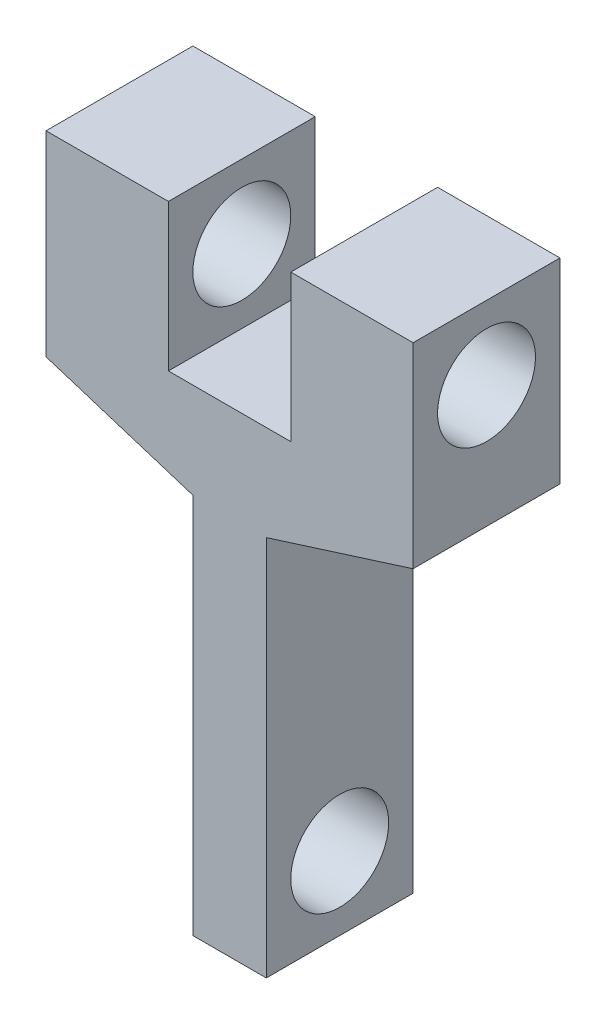
ISO-10303-21;
HEADER;
FILE_DESCRIPTION(('STEP AP214'),'2;1');
FILE_NAME('part.step','',(''),(''),'','','');
FILE_SCHEMA(('AUTOMOTIVE_DESIGN { 1 0 10303 214 1 1 1 1 }'));
ENDSEC;
DATA;
#1=APPLICATION_CONTEXT('core data for automotive mechanical design processes');
#2=APPLICATION_PROTOCOL_DEFINITION('international standard','automotive_design',2000,#1);
#3=PRODUCT_CONTEXT('',#1,'mechanical');
#4=PRODUCT('Part','Part','',(#3));
#5=PRODUCT_RELATED_PRODUCT_CATEGORY('part','',(#4));
#6=PRODUCT_DEFINITION_FORMATION('','',#4);
#7=PRODUCT_DEFINITION_CONTEXT('part definition',#1,'design');
#8=PRODUCT_DEFINITION('design','',#6,#7);
#9=PRODUCT_DEFINITION_SHAPE('','',#8);
#10=(LENGTH_UNIT() NAMED_UNIT(*) SI_UNIT(.MILLI.,.METRE.));
#11=(NAMED_UNIT(*) PLANE_ANGLE_UNIT() SI_UNIT($,.RADIAN.));
#12=(NAMED_UNIT(*) SI_UNIT($,.STERADIAN.) SOLID_ANGLE_UNIT());
#13=UNCERTAINTY_MEASURE_WITH_UNIT(LENGTH_MEASURE(1.E-05),#10,'distance_accuracy_value','');
#14=(GEOMETRIC_REPRESENTATION_CONTEXT(3) GLOBAL_UNCERTAINTY_ASSIGNED_CONTEXT((#13)) GLOBAL_UNIT_ASSIGNED_CONTEXT((#10,
#11,#12)) REPRESENTATION_CONTEXT('',''));
#15=CARTESIAN_POINT('',(0.,0.,0.));
#16=DIRECTION('',(0.,0.,1.));
#17=DIRECTION('',(1.,0.,0.));
#18=AXIS2_PLACEMENT_3D('',#15,#16,#17);
#19=CARTESIAN_POINT('',(2.5,9.7411897148694,6.));
#20=DIRECTION('',(1.,0.,0.));
#21=DIRECTION('',(0.,0.,-1.));
#22=AXIS2_PLACEMENT_3D('',#19,#20,#21);
#23=PLANE('',#22);
#24=CARTESIAN_POINT('',(2.5,12.7411897148694,3.));
#25=DIRECTION('',(1.,0.,0.));
#26=DIRECTION('',(0.,0.,-1.));
#27=AXIS2_PLACEMENT_3D('',#24,#25,#26);
#28=CIRCLE('',#27,2.);
#29=CARTESIAN_POINT('',(2.5,12.7411897148694,1.));
#30=VERTEX_POINT('',#29);
#31=EDGE_CURVE('E158',#30,#30,#28,.T.);
#32=ORIENTED_EDGE('',*,*,#31,.T.);
#33=EDGE_LOOP('',(#32));
#34=FACE_BOUND('',#33,.T.);
#35=DIRECTION('',(0.,-1.,0.));
#36=VECTOR('',#35,1.);
#37=CARTESIAN_POINT('',(2.5,9.7411897148694,0.));
#38=LINE('',#37,#36);
#39=CARTESIAN_POINT('',(2.5,15.7411897148694,0.));
#40=VERTEX_POINT('',#39);
#41=CARTESIAN_POINT('',(2.5,9.7411897148694,0.));
#42=VERTEX_POINT('',#41);
#43=EDGE_CURVE('E154',#40,#42,#38,.T.);
#44=ORIENTED_EDGE('',*,*,#43,.T.);
#45=DIRECTION('',(0.,0.,-1.));
#46=VECTOR('',#45,1.);
#47=CARTESIAN_POINT('',(2.5,9.7411897148694,6.));
#48=LINE('',#47,#46);
#49=CARTESIAN_POINT('',(2.5,9.7411897148694,6.));
#50=VERTEX_POINT('',#49);
#51=EDGE_CURVE('E11',#50,#42,#48,.T.);
#52=ORIENTED_EDGE('',*,*,#51,.F.);
#53=DIRECTION('',(0.,-1.,0.));
#54=VECTOR('',#53,1.);
#55=CARTESIAN_POINT('',(2.5,9.7411897148694,6.));
#56=LINE('',#55,#54);
#57=CARTESIAN_POINT('',(2.5,15.7411897148694,6.));
#58=VERTEX_POINT('',#57);
#59=EDGE_CURVE('E177',#58,#50,#56,.T.);
#60=ORIENTED_EDGE('',*,*,#59,.F.);
#61=DIRECTION('',(0.,0.,-1.));
#62=VECTOR('',#61,1.);
#63=CARTESIAN_POINT('',(2.5,15.7411897148694,6.));
#64=LINE('',#63,#62);
#65=EDGE_CURVE('E150',#58,#40,#64,.T.);
#66=ORIENTED_EDGE('',*,*,#65,.T.);
#67=EDGE_LOOP('',(#44,#52,#60,#66));
#68=FACE_BOUND('',#67,.T.);
#69=ADVANCED_FACE('F34',(#34,#68),#23,.F.);
#70=CARTESIAN_POINT('',(-2.5,9.7411897148694,6.));
#71=DIRECTION('',(0.,-1.,0.));
#72=DIRECTION('',(0.,0.,-1.));
#73=AXIS2_PLACEMENT_3D('',#70,#71,#72);
#74=PLANE('',#73);
#75=DIRECTION('',(-1.,0.,0.));
#76=VECTOR('',#75,1.);
#77=CARTESIAN_POINT('',(-2.5,9.7411897148694,0.));
#78=LINE('',#77,#76);
#79=CARTESIAN_POINT('',(-2.5,9.7411897148694,0.));
#80=VERTEX_POINT('',#79);
#81=EDGE_CURVE('E157',#42,#80,#78,.T.);
#82=ORIENTED_EDGE('',*,*,#81,.T.);
#83=DIRECTION('',(0.,0.,-1.));
#84=VECTOR('',#83,1.);
#85=CARTESIAN_POINT('',(-2.5,9.7411897148694,6.));
#86=LINE('',#85,#84);
#87=CARTESIAN_POINT('',(-2.5,9.7411897148694,6.));
#88=VERTEX_POINT('',#87);
#89=EDGE_CURVE('E42',#88,#80,#86,.T.);
#90=ORIENTED_EDGE('',*,*,#89,.F.);
#91=DIRECTION('',(-1.,0.,0.));
#92=VECTOR('',#91,1.);
#93=CARTESIAN_POINT('',(-2.5,9.7411897148694,6.));
#94=LINE('',#93,#92);
#95=EDGE_CURVE('E105',#50,#88,#94,.T.);
#96=ORIENTED_EDGE('',*,*,#95,.F.);
#97=ORIENTED_EDGE('',*,*,#51,.T.);
#98=EDGE_LOOP('',(#82,#90,#96,#97));
#99=FACE_BOUND('',#98,.T.);
#100=ADVANCED_FACE('F256',(#99),#74,.F.);
#101=CARTESIAN_POINT('',(-2.5,9.7411897148694,6.));
#102=DIRECTION('',(-1.,0.,0.));
#103=DIRECTION('',(0.,0.,1.));
#104=AXIS2_PLACEMENT_3D('',#101,#102,#103);
#105=PLANE('',#104);
#106=CARTESIAN_POINT('',(-2.5,12.7411897148694,3.));
#107=DIRECTION('',(-1.,0.,0.));
#108=DIRECTION('',(0.,0.,1.));
#109=AXIS2_PLACEMENT_3D('',#106,#107,#108);
#110=CIRCLE('',#109,2.);
#111=CARTESIAN_POINT('',(-2.5,12.7411897148694,5.));
#112=VERTEX_POINT('',#111);
#113=EDGE_CURVE('E264',#112,#112,#110,.T.);
#114=ORIENTED_EDGE('',*,*,#113,.T.);
#115=EDGE_LOOP('',(#114));
#116=FACE_BOUND('',#115,.T.);
#117=DIRECTION('',(0.,1.,0.));
#118=VECTOR('',#117,1.);
#119=CARTESIAN_POINT('',(-2.5,9.7411897148694,0.));
#120=LINE('',#119,#118);
#121=CARTESIAN_POINT('',(-2.5,15.7411897148694,0.));
#122=VERTEX_POINT('',#121);
#123=EDGE_CURVE('E160',#80,#122,#120,.T.);
#124=ORIENTED_EDGE('',*,*,#123,.T.);
#125=DIRECTION('',(0.,0.,-1.));
#126=VECTOR('',#125,1.);
#127=CARTESIAN_POINT('',(-2.5,15.7411897148694,6.));
#128=LINE('',#127,#126);
#129=CARTESIAN_POINT('',(-2.5,15.7411897148694,6.));
#130=VERTEX_POINT('',#129);
#131=EDGE_CURVE('E196',#130,#122,#128,.T.);
#132=ORIENTED_EDGE('',*,*,#131,.F.);
#133=DIRECTION('',(0.,1.,0.));
#134=VECTOR('',#133,1.);
#135=CARTESIAN_POINT('',(-2.5,9.7411897148694,6.));
#136=LINE('',#135,#134);
#137=EDGE_CURVE('E204',#88,#130,#136,.T.);
#138=ORIENTED_EDGE('',*,*,#137,.F.);
#139=ORIENTED_EDGE('',*,*,#89,.T.);
#140=EDGE_LOOP('',(#124,#132,#138,#139));
#141=FACE_BOUND('',#140,.T.);
#142=ADVANCED_FACE('F202',(#116,#141),#105,.F.);
#143=CARTESIAN_POINT('',(-2.5,15.7411897148694,6.));
#144=DIRECTION('',(0.,-1.,0.));
#145=DIRECTION('',(1.,0.,0.));
#146=AXIS2_PLACEMENT_3D('',#143,#144,#145);
#147=PLANE('',#146);
#148=DIRECTION('',(-1.,0.,0.));
#149=VECTOR('',#148,1.);
#150=CARTESIAN_POINT('',(-2.5,15.7411897148694,0.));
#151=LINE('',#150,#149);
#152=CARTESIAN_POINT('',(-7.5,15.7411897148694,0.));
#153=VERTEX_POINT('',#152);
#154=EDGE_CURVE('E162',#122,#153,#151,.T.);
#155=ORIENTED_EDGE('',*,*,#154,.T.);
#156=DIRECTION('',(0.,0.,-1.));
#157=VECTOR('',#156,1.);
#158=CARTESIAN_POINT('',(-7.5,15.7411897148694,6.));
#159=LINE('',#158,#157);
#160=CARTESIAN_POINT('',(-7.5,15.7411897148694,6.));
#161=VERTEX_POINT('',#160);
#162=EDGE_CURVE('E193',#161,#153,#159,.T.);
#163=ORIENTED_EDGE('',*,*,#162,.F.);
#164=DIRECTION('',(-1.,0.,0.));
#165=VECTOR('',#164,1.);
#166=CARTESIAN_POINT('',(-2.5,15.7411897148694,6.));
#167=LINE('',#166,#165);
#168=EDGE_CURVE('E222',#130,#161,#167,.T.);
#169=ORIENTED_EDGE('',*,*,#168,.F.);
#170=ORIENTED_EDGE('',*,*,#131,.T.);
#171=EDGE_LOOP('',(#155,#163,#169,#170));
#172=FACE_BOUND('',#171,.T.);
#173=ADVANCED_FACE('F213',(#172),#147,.F.);
#174=CARTESIAN_POINT('',(-7.5,7.74118971486941,6.));
#175=DIRECTION('',(1.,0.,0.));
#176=DIRECTION('',(0.,0.,-1.));
#177=AXIS2_PLACEMENT_3D('',#174,#175,#176);
#178=PLANE('',#177);
#179=CARTESIAN_POINT('',(-7.5,12.7411897148694,3.));
#180=DIRECTION('',(1.,0.,0.));
#181=DIRECTION('',(0.,0.,-1.));
#182=AXIS2_PLACEMENT_3D('',#179,#180,#181);
#183=CIRCLE('',#182,2.);
#184=CARTESIAN_POINT('',(-7.5,12.7411897148694,1.));
#185=VERTEX_POINT('',#184);
#186=EDGE_CURVE('E267',#185,#185,#183,.F.);
#187=ORIENTED_EDGE('',*,*,#186,.F.);
#188=EDGE_LOOP('',(#187));
#189=FACE_BOUND('',#188,.T.);
#190=DIRECTION('',(0.,-1.,0.));
#191=VECTOR('',#190,1.);
#192=CARTESIAN_POINT('',(-7.5,7.74118971486941,0.));
#193=LINE('',#192,#191);
#194=CARTESIAN_POINT('',(-7.5,7.74118971486941,0.));
#195=VERTEX_POINT('',#194);
#196=EDGE_CURVE('E164',#153,#195,#193,.T.);
#197=ORIENTED_EDGE('',*,*,#196,.T.);
#198=DIRECTION('',(0.,0.,-1.));
#199=VECTOR('',#198,1.);
#200=CARTESIAN_POINT('',(-7.5,7.74118971486941,6.));
#201=LINE('',#200,#199);
#202=CARTESIAN_POINT('',(-7.5,7.74118971486941,6.));
#203=VERTEX_POINT('',#202);
#204=EDGE_CURVE('E190',#203,#195,#201,.T.);
#205=ORIENTED_EDGE('',*,*,#204,.F.);
#206=DIRECTION('',(0.,-1.,0.));
#207=VECTOR('',#206,1.);
#208=CARTESIAN_POINT('',(-7.5,7.74118971486941,6.));
#209=LINE('',#208,#207);
#210=EDGE_CURVE('E219',#161,#203,#209,.T.);
#211=ORIENTED_EDGE('',*,*,#210,.F.);
#212=ORIENTED_EDGE('',*,*,#162,.T.);
#213=EDGE_LOOP('',(#197,#205,#211,#212));
#214=FACE_BOUND('',#213,.T.);
#215=ADVANCED_FACE('F217',(#189,#214),#178,.F.);
#216=CARTESIAN_POINT('',(-7.5,7.74118971486941,6.));
#217=DIRECTION('',(0.301382660764141,0.953503273088628,0.));
#218=DIRECTION('',(-0.953503273088628,0.301382660764141,0.));
#219=AXIS2_PLACEMENT_3D('',#216,#217,#218);
#220=PLANE('',#219);
#221=DIRECTION('',(0.953503273088628,-0.301382660764141,0.));
#222=VECTOR('',#221,1.);
#223=CARTESIAN_POINT('',(-7.5,7.74118971486941,0.));
#224=LINE('',#223,#222);
#225=CARTESIAN_POINT('',(-1.5,5.84471382892164,0.));
#226=VERTEX_POINT('',#225);
#227=EDGE_CURVE('E166',#195,#226,#224,.T.);
#228=ORIENTED_EDGE('',*,*,#227,.T.);
#229=DIRECTION('',(0.,0.,-1.));
#230=VECTOR('',#229,1.);
#231=CARTESIAN_POINT('',(-1.5,5.84471382892164,6.));
#232=LINE('',#231,#230);
#233=CARTESIAN_POINT('',(-1.5,5.84471382892164,6.));
#234=VERTEX_POINT('',#233);
#235=EDGE_CURVE('E187',#234,#226,#232,.T.);
#236=ORIENTED_EDGE('',*,*,#235,.F.);
#237=DIRECTION('',(0.953503273088628,-0.301382660764141,0.));
#238=VECTOR('',#237,1.);
#239=CARTESIAN_POINT('',(-7.5,7.74118971486941,6.));
#240=LINE('',#239,#238);
#241=EDGE_CURVE('E221',#203,#234,#240,.T.);
#242=ORIENTED_EDGE('',*,*,#241,.F.);
#243=ORIENTED_EDGE('',*,*,#204,.T.);
#244=EDGE_LOOP('',(#228,#236,#242,#243));
#245=FACE_BOUND('',#244,.T.);
#246=ADVANCED_FACE('F298',(#245),#220,.F.);
#247=CARTESIAN_POINT('',(-1.5,5.84471382892164,6.));
#248=DIRECTION('',(1.,0.,0.));
#249=DIRECTION('',(0.,1.,0.));
#250=AXIS2_PLACEMENT_3D('',#247,#248,#249);
#251=PLANE('',#250);
#252=CARTESIAN_POINT('',(-1.5,-6.7411897148694,3.));
#253=DIRECTION('',(1.,0.,0.));
#254=DIRECTION('',(0.,1.,0.));
#255=AXIS2_PLACEMENT_3D('',#252,#253,#254);
#256=CIRCLE('',#255,2.);
#257=CARTESIAN_POINT('',(-1.5,-4.7411897148694,3.));
#258=VERTEX_POINT('',#257);
#259=EDGE_CURVE('E277',#258,#258,#256,.F.);
#260=ORIENTED_EDGE('',*,*,#259,.F.);
#261=EDGE_LOOP('',(#260));
#262=FACE_BOUND('',#261,.T.);
#263=DIRECTION('',(0.,-1.,0.));
#264=VECTOR('',#263,1.);
#265=CARTESIAN_POINT('',(-1.5,5.84471382892164,0.));
#266=LINE('',#265,#264);
#267=CARTESIAN_POINT('',(-1.5,-9.7411897148694,0.));
#268=VERTEX_POINT('',#267);
#269=EDGE_CURVE('E168',#226,#268,#266,.T.);
#270=ORIENTED_EDGE('',*,*,#269,.T.);
#271=DIRECTION('',(0.,0.,-1.));
#272=VECTOR('',#271,1.);
#273=CARTESIAN_POINT('',(-1.5,-9.7411897148694,6.));
#274=LINE('',#273,#272);
#275=CARTESIAN_POINT('',(-1.5,-9.7411897148694,6.));
#276=VERTEX_POINT('',#275);
#277=EDGE_CURVE('E184',#276,#268,#274,.T.);
#278=ORIENTED_EDGE('',*,*,#277,.F.);
#279=DIRECTION('',(0.,-1.,0.));
#280=VECTOR('',#279,1.);
#281=CARTESIAN_POINT('',(-1.5,5.84471382892164,6.));
#282=LINE('',#281,#280);
#283=EDGE_CURVE('E224',#234,#276,#282,.T.);
#284=ORIENTED_EDGE('',*,*,#283,.F.);
#285=ORIENTED_EDGE('',*,*,#235,.T.);
#286=EDGE_LOOP('',(#270,#278,#284,#285));
#287=FACE_BOUND('',#286,.T.);
#288=ADVANCED_FACE('F293',(#262,#287),#251,.F.);
#289=CARTESIAN_POINT('',(-1.5,-9.7411897148694,6.));
#290=DIRECTION('',(0.,1.,0.));
#291=DIRECTION('',(0.,0.,1.));
#292=AXIS2_PLACEMENT_3D('',#289,#290,#291);
#293=PLANE('',#292);
#294=DIRECTION('',(1.,0.,0.));
#295=VECTOR('',#294,1.);
#296=CARTESIAN_POINT('',(-1.5,-9.7411897148694,0.));
#297=LINE('',#296,#295);
#298=CARTESIAN_POINT('',(1.5,-9.7411897148694,0.));
#299=VERTEX_POINT('',#298);
#300=EDGE_CURVE('E170',#268,#299,#297,.T.);
#301=ORIENTED_EDGE('',*,*,#300,.T.);
#302=DIRECTION('',(0.,0.,-1.));
#303=VECTOR('',#302,1.);
#304=CARTESIAN_POINT('',(1.5,-9.7411897148694,6.));
#305=LINE('',#304,#303);
#306=CARTESIAN_POINT('',(1.5,-9.7411897148694,6.));
#307=VERTEX_POINT('',#306);
#308=EDGE_CURVE('E181',#307,#299,#305,.T.);
#309=ORIENTED_EDGE('',*,*,#308,.F.);
#310=DIRECTION('',(1.,0.,0.));
#311=VECTOR('',#310,1.);
#312=CARTESIAN_POINT('',(-1.5,-9.7411897148694,6.));
#313=LINE('',#312,#311);
#314=EDGE_CURVE('E230',#276,#307,#313,.T.);
#315=ORIENTED_EDGE('',*,*,#314,.F.);
#316=ORIENTED_EDGE('',*,*,#277,.T.);
#317=EDGE_LOOP('',(#301,#309,#315,#316));
#318=FACE_BOUND('',#317,.T.);
#319=ADVANCED_FACE('F236',(#318),#293,.F.);
#320=CARTESIAN_POINT('',(1.5,5.84471382892164,6.));
#321=DIRECTION('',(-1.,0.,0.));
#322=DIRECTION('',(0.,-1.,0.));
#323=AXIS2_PLACEMENT_3D('',#320,#321,#322);
#324=PLANE('',#323);
#325=CARTESIAN_POINT('',(1.5,-6.7411897148694,3.));
#326=DIRECTION('',(1.,0.,0.));
#327=DIRECTION('',(0.,1.,0.));
#328=AXIS2_PLACEMENT_3D('',#325,#326,#327);
#329=CIRCLE('',#328,2.);
#330=CARTESIAN_POINT('',(1.5,-4.7411897148694,3.));
#331=VERTEX_POINT('',#330);
#332=EDGE_CURVE('E280',#331,#331,#329,.T.);
#333=ORIENTED_EDGE('',*,*,#332,.F.);
#334=EDGE_LOOP('',(#333));
#335=FACE_BOUND('',#334,.T.);
#336=DIRECTION('',(0.,1.,0.));
#337=VECTOR('',#336,1.);
#338=CARTESIAN_POINT('',(1.5,5.84471382892164,0.));
#339=LINE('',#338,#337);
#340=CARTESIAN_POINT('',(1.5,5.84471382892164,0.));
#341=VERTEX_POINT('',#340);
#342=EDGE_CURVE('E172',#299,#341,#339,.T.);
#343=ORIENTED_EDGE('',*,*,#342,.T.);
#344=DIRECTION('',(0.,0.,-1.));
#345=VECTOR('',#344,1.);
#346=CARTESIAN_POINT('',(1.5,5.84471382892164,6.));
#347=LINE('',#346,#345);
#348=CARTESIAN_POINT('',(1.5,5.84471382892164,6.));
#349=VERTEX_POINT('',#348);
#350=EDGE_CURVE('E145',#349,#341,#347,.T.);
#351=ORIENTED_EDGE('',*,*,#350,.F.);
#352=DIRECTION('',(0.,1.,0.));
#353=VECTOR('',#352,1.);
#354=CARTESIAN_POINT('',(1.5,5.84471382892164,6.));
#355=LINE('',#354,#353);
#356=EDGE_CURVE('E136',#307,#349,#355,.T.);
#357=ORIENTED_EDGE('',*,*,#356,.F.);
#358=ORIENTED_EDGE('',*,*,#308,.T.);
#359=EDGE_LOOP('',(#343,#351,#357,#358));
#360=FACE_BOUND('',#359,.T.);
#361=ADVANCED_FACE('F240',(#335,#360),#324,.F.);
#362=CARTESIAN_POINT('',(7.5,7.74118971486941,6.));
#363=DIRECTION('',(-0.301382660764141,0.953503273088628,0.));
#364=DIRECTION('',(-0.953503273088628,-0.301382660764141,0.));
#365=AXIS2_PLACEMENT_3D('',#362,#363,#364);
#366=PLANE('',#365);
#367=DIRECTION('',(0.953503273088628,0.301382660764141,0.));
#368=VECTOR('',#367,1.);
#369=CARTESIAN_POINT('',(7.5,7.74118971486941,0.));
#370=LINE('',#369,#368);
#371=CARTESIAN_POINT('',(7.5,7.74118971486941,0.));
#372=VERTEX_POINT('',#371);
#373=EDGE_CURVE('E144',#341,#372,#370,.T.);
#374=ORIENTED_EDGE('',*,*,#373,.T.);
#375=DIRECTION('',(0.,0.,-1.));
#376=VECTOR('',#375,1.);
#377=CARTESIAN_POINT('',(7.5,7.74118971486941,6.));
#378=LINE('',#377,#376);
#379=CARTESIAN_POINT('',(7.5,7.74118971486941,6.));
#380=VERTEX_POINT('',#379);
#381=EDGE_CURVE('E141',#380,#372,#378,.T.);
#382=ORIENTED_EDGE('',*,*,#381,.F.);
#383=DIRECTION('',(0.953503273088628,0.301382660764141,0.));
#384=VECTOR('',#383,1.);
#385=CARTESIAN_POINT('',(7.5,7.74118971486941,6.));
#386=LINE('',#385,#384);
#387=EDGE_CURVE('E130',#349,#380,#386,.T.);
#388=ORIENTED_EDGE('',*,*,#387,.F.);
#389=ORIENTED_EDGE('',*,*,#350,.T.);
#390=EDGE_LOOP('',(#374,#382,#388,#389));
#391=FACE_BOUND('',#390,.T.);
#392=ADVANCED_FACE('F142',(#391),#366,.F.);
#393=CARTESIAN_POINT('',(7.5,7.74118971486941,6.));
#394=DIRECTION('',(-1.,0.,0.));
#395=DIRECTION('',(0.,0.,1.));
#396=AXIS2_PLACEMENT_3D('',#393,#394,#395);
#397=PLANE('',#396);
#398=CARTESIAN_POINT('',(7.5,12.7411897148694,3.));
#399=DIRECTION('',(1.,0.,0.));
#400=DIRECTION('',(0.,0.,-1.));
#401=AXIS2_PLACEMENT_3D('',#398,#399,#400);
#402=CIRCLE('',#401,2.);
#403=CARTESIAN_POINT('',(7.5,12.7411897148694,1.));
#404=VERTEX_POINT('',#403);
#405=EDGE_CURVE('E274',#404,#404,#402,.T.);
#406=ORIENTED_EDGE('',*,*,#405,.F.);
#407=EDGE_LOOP('',(#406));
#408=FACE_BOUND('',#407,.T.);
#409=DIRECTION('',(0.,1.,0.));
#410=VECTOR('',#409,1.);
#411=CARTESIAN_POINT('',(7.5,7.74118971486941,0.));
#412=LINE('',#411,#410);
#413=CARTESIAN_POINT('',(7.5,15.7411897148694,0.));
#414=VERTEX_POINT('',#413);
#415=EDGE_CURVE('E91',#372,#414,#412,.T.);
#416=ORIENTED_EDGE('',*,*,#415,.T.);
#417=DIRECTION('',(0.,0.,-1.));
#418=VECTOR('',#417,1.);
#419=CARTESIAN_POINT('',(7.5,15.7411897148694,6.));
#420=LINE('',#419,#418);
#421=CARTESIAN_POINT('',(7.5,15.7411897148694,6.));
#422=VERTEX_POINT('',#421);
#423=EDGE_CURVE('E146',#422,#414,#420,.T.);
#424=ORIENTED_EDGE('',*,*,#423,.F.);
#425=DIRECTION('',(0.,1.,0.));
#426=VECTOR('',#425,1.);
#427=CARTESIAN_POINT('',(7.5,7.74118971486941,6.));
#428=LINE('',#427,#426);
#429=EDGE_CURVE('E134',#380,#422,#428,.T.);
#430=ORIENTED_EDGE('',*,*,#429,.F.);
#431=ORIENTED_EDGE('',*,*,#381,.T.);
#432=EDGE_LOOP('',(#416,#424,#430,#431));
#433=FACE_BOUND('',#432,.T.);
#434=ADVANCED_FACE('F148',(#408,#433),#397,.F.);
#435=CARTESIAN_POINT('',(2.5,15.7411897148694,6.));
#436=DIRECTION('',(0.,-1.,0.));
#437=DIRECTION('',(1.,0.,0.));
#438=AXIS2_PLACEMENT_3D('',#435,#436,#437);
#439=PLANE('',#438);
#440=DIRECTION('',(-1.,0.,0.));
#441=VECTOR('',#440,1.);
#442=CARTESIAN_POINT('',(2.5,15.7411897148694,0.));
#443=LINE('',#442,#441);
#444=EDGE_CURVE('E97',#414,#40,#443,.T.);
#445=ORIENTED_EDGE('',*,*,#444,.T.);
#446=ORIENTED_EDGE('',*,*,#65,.F.);
#447=DIRECTION('',(-1.,0.,0.));
#448=VECTOR('',#447,1.);
#449=CARTESIAN_POINT('',(2.5,15.7411897148694,6.));
#450=LINE('',#449,#448);
#451=EDGE_CURVE('E50',#422,#58,#450,.T.);
#452=ORIENTED_EDGE('',*,*,#451,.F.);
#453=ORIENTED_EDGE('',*,*,#423,.T.);
#454=EDGE_LOOP('',(#445,#446,#452,#453));
#455=FACE_BOUND('',#454,.T.);
#456=ADVANCED_FACE('F244',(#455),#439,.F.);
#457=CARTESIAN_POINT('',(0.,0.,6.));
#458=DIRECTION('',(0.,0.,-1.));
#459=DIRECTION('',(-1.,0.,0.));
#460=AXIS2_PLACEMENT_3D('',#457,#458,#459);
#461=PLANE('',#460);
#462=ORIENTED_EDGE('',*,*,#59,.T.);
#463=ORIENTED_EDGE('',*,*,#95,.T.);
#464=ORIENTED_EDGE('',*,*,#137,.T.);
#465=ORIENTED_EDGE('',*,*,#168,.T.);
#466=ORIENTED_EDGE('',*,*,#210,.T.);
#467=ORIENTED_EDGE('',*,*,#241,.T.);
#468=ORIENTED_EDGE('',*,*,#283,.T.);
#469=ORIENTED_EDGE('',*,*,#314,.T.);
#470=ORIENTED_EDGE('',*,*,#356,.T.);
#471=ORIENTED_EDGE('',*,*,#387,.T.);
#472=ORIENTED_EDGE('',*,*,#429,.T.);
#473=ORIENTED_EDGE('',*,*,#451,.T.);
#474=EDGE_LOOP('',(#462,#463,#464,#465,#466,#467,#468,#469,#470,#471,#472,#473));
#475=FACE_BOUND('',#474,.T.);
#476=ADVANCED_FACE('F132',(#475),#461,.F.);
#477=CARTESIAN_POINT('',(0.,0.,0.));
#478=DIRECTION('',(0.,0.,-1.));
#479=DIRECTION('',(-1.,0.,0.));
#480=AXIS2_PLACEMENT_3D('',#477,#478,#479);
#481=PLANE('',#480);
#482=ORIENTED_EDGE('',*,*,#43,.F.);
#483=ORIENTED_EDGE('',*,*,#444,.F.);
#484=ORIENTED_EDGE('',*,*,#415,.F.);
#485=ORIENTED_EDGE('',*,*,#373,.F.);
#486=ORIENTED_EDGE('',*,*,#342,.F.);
#487=ORIENTED_EDGE('',*,*,#300,.F.);
#488=ORIENTED_EDGE('',*,*,#269,.F.);
#489=ORIENTED_EDGE('',*,*,#227,.F.);
#490=ORIENTED_EDGE('',*,*,#196,.F.);
#491=ORIENTED_EDGE('',*,*,#154,.F.);
#492=ORIENTED_EDGE('',*,*,#123,.F.);
#493=ORIENTED_EDGE('',*,*,#81,.F.);
#494=EDGE_LOOP('',(#482,#483,#484,#485,#486,#487,#488,#489,#490,#491,#492,#493));
#495=FACE_BOUND('',#494,.T.);
#496=ADVANCED_FACE('F208',(#495),#481,.T.);
#497=CARTESIAN_POINT('',(-13.1568542494924,12.7411897148694,3.));
#498=DIRECTION('',(1.,0.,0.));
#499=DIRECTION('',(0.,0.,-1.));
#500=AXIS2_PLACEMENT_3D('',#497,#498,#499);
#501=CYLINDRICAL_SURFACE('',#500,2.);
#502=ORIENTED_EDGE('',*,*,#405,.T.);
#503=EDGE_LOOP('',(#502));
#504=FACE_BOUND('',#503,.T.);
#505=ORIENTED_EDGE('',*,*,#31,.F.);
#506=EDGE_LOOP('',(#505));
#507=FACE_BOUND('',#506,.T.);
#508=ADVANCED_FACE('F316',(#504,#507),#501,.F.);
#509=ORIENTED_EDGE('',*,*,#186,.T.);
#510=EDGE_LOOP('',(#509));
#511=FACE_BOUND('',#510,.T.);
#512=ORIENTED_EDGE('',*,*,#113,.F.);
#513=EDGE_LOOP('',(#512));
#514=FACE_BOUND('',#513,.T.);
#515=ADVANCED_FACE('F314',(#511,#514),#501,.F.);
#516=CARTESIAN_POINT('',(-7.15685424949238,-6.7411897148694,3.));
#517=DIRECTION('',(1.,0.,0.));
#518=DIRECTION('',(0.,1.,0.));
#519=AXIS2_PLACEMENT_3D('',#516,#517,#518);
#520=CYLINDRICAL_SURFACE('',#519,2.);
#521=ORIENTED_EDGE('',*,*,#259,.T.);
#522=EDGE_LOOP('',(#521));
#523=FACE_BOUND('',#522,.T.);
#524=ORIENTED_EDGE('',*,*,#332,.T.);
#525=EDGE_LOOP('',(#524));
#526=FACE_BOUND('',#525,.T.);
#527=ADVANCED_FACE('F284',(#523,#526),#520,.F.);
#528=CLOSED_SHELL('',(#69,#100,#142,#173,#215,#246,#288,#319,#361,#392,#434,#456,#476,#496,#508,
#515,#527));
#529=MANIFOLD_SOLID_BREP('B2',#528);
#530=ADVANCED_BREP_SHAPE_REPRESENTATION('',(#18,#529),#14);
#531=SHAPE_DEFINITION_REPRESENTATION(#9,#530);
ENDSEC;
END-ISO-10303-21;
